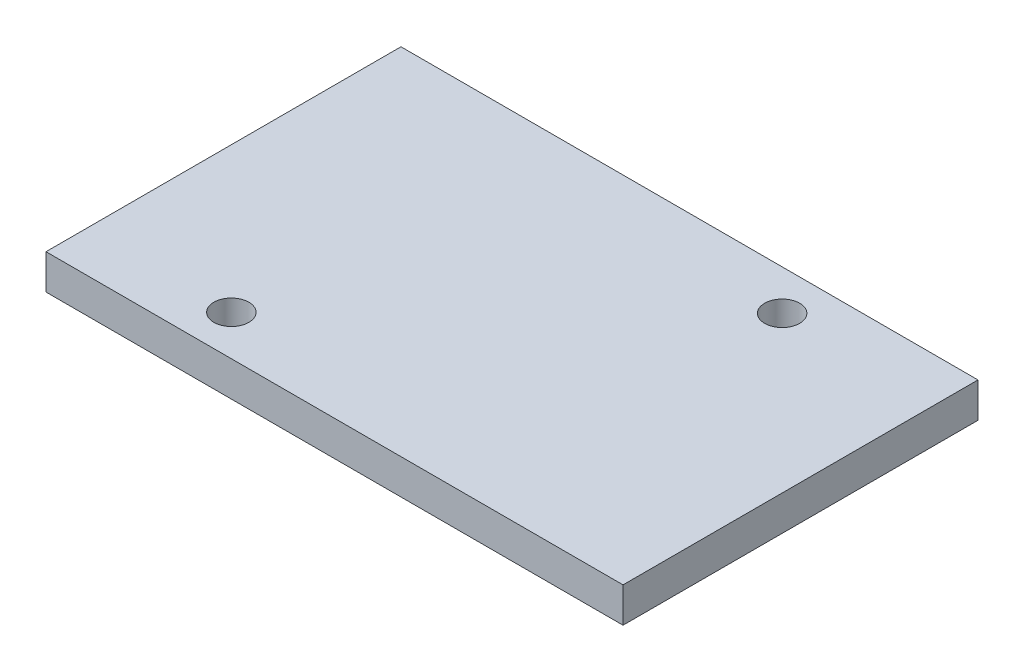
ISO-10303-21;
HEADER;
FILE_DESCRIPTION(('STEP AP214'),'2;1');
FILE_NAME('part.step','',(''),(''),'','','');
FILE_SCHEMA(('AUTOMOTIVE_DESIGN { 1 0 10303 214 1 1 1 1 }'));
ENDSEC;
DATA;
#1=APPLICATION_CONTEXT('core data for automotive mechanical design processes');
#2=APPLICATION_PROTOCOL_DEFINITION('international standard','automotive_design',2000,#1);
#3=PRODUCT_CONTEXT('',#1,'mechanical');
#4=PRODUCT('Part','Part','',(#3));
#5=PRODUCT_RELATED_PRODUCT_CATEGORY('part','',(#4));
#6=PRODUCT_DEFINITION_FORMATION('','',#4);
#7=PRODUCT_DEFINITION_CONTEXT('part definition',#1,'design');
#8=PRODUCT_DEFINITION('design','',#6,#7);
#9=PRODUCT_DEFINITION_SHAPE('','',#8);
#10=(LENGTH_UNIT() NAMED_UNIT(*) SI_UNIT(.MILLI.,.METRE.));
#11=(NAMED_UNIT(*) PLANE_ANGLE_UNIT() SI_UNIT($,.RADIAN.));
#12=(NAMED_UNIT(*) SI_UNIT($,.STERADIAN.) SOLID_ANGLE_UNIT());
#13=UNCERTAINTY_MEASURE_WITH_UNIT(LENGTH_MEASURE(1.E-05),#10,'distance_accuracy_value','');
#14=(GEOMETRIC_REPRESENTATION_CONTEXT(3) GLOBAL_UNCERTAINTY_ASSIGNED_CONTEXT((#13)) GLOBAL_UNIT_ASSIGNED_CONTEXT((#10,
#11,#12)) REPRESENTATION_CONTEXT('',''));
#15=CARTESIAN_POINT('',(0.,0.,0.));
#16=DIRECTION('',(0.,0.,1.));
#17=DIRECTION('',(1.,0.,0.));
#18=AXIS2_PLACEMENT_3D('',#15,#16,#17);
#19=CARTESIAN_POINT('',(0.,2.,0.));
#20=DIRECTION('',(0.,1.,0.));
#21=DIRECTION('',(0.,0.,1.));
#22=AXIS2_PLACEMENT_3D('',#19,#20,#21);
#23=PLANE('',#22);
#24=CARTESIAN_POINT('',(-109.969565217391,2.,-10.3538043478261));
#25=DIRECTION('',(0.,1.,0.));
#26=DIRECTION('',(0.,0.,1.));
#27=AXIS2_PLACEMENT_3D('',#24,#25,#26);
#28=CIRCLE('',#27,0.999999999999998);
#29=CARTESIAN_POINT('',(-109.969565217391,2.,-9.35380434782608));
#30=VERTEX_POINT('',#29);
#31=EDGE_CURVE('E112',#30,#30,#28,.T.);
#32=ORIENTED_EDGE('',*,*,#31,.F.);
#33=EDGE_LOOP('',(#32));
#34=FACE_BOUND('',#33,.T.);
#35=DIRECTION('',(0.,0.,1.));
#36=VECTOR('',#35,1.);
#37=CARTESIAN_POINT('',(-118.269565217391,2.,-28.3538043478261));
#38=LINE('',#37,#36);
#39=CARTESIAN_POINT('',(-118.269565217391,2.,-28.3538043478261));
#40=VERTEX_POINT('',#39);
#41=CARTESIAN_POINT('',(-118.269565217391,2.,-8.05380434782608));
#42=VERTEX_POINT('',#41);
#43=EDGE_CURVE('E92',#40,#42,#38,.T.);
#44=ORIENTED_EDGE('',*,*,#43,.T.);
#45=DIRECTION('',(1.,0.,0.));
#46=VECTOR('',#45,1.);
#47=CARTESIAN_POINT('',(-118.269565217391,2.,-8.05380434782608));
#48=LINE('',#47,#46);
#49=CARTESIAN_POINT('',(-85.2695652173913,2.,-8.05380434782608));
#50=VERTEX_POINT('',#49);
#51=EDGE_CURVE('E87',#42,#50,#48,.T.);
#52=ORIENTED_EDGE('',*,*,#51,.T.);
#53=DIRECTION('',(0.,0.,-1.));
#54=VECTOR('',#53,1.);
#55=CARTESIAN_POINT('',(-85.2695652173913,2.,-28.3538043478261));
#56=LINE('',#55,#54);
#57=CARTESIAN_POINT('',(-85.2695652173913,2.,-28.3538043478261));
#58=VERTEX_POINT('',#57);
#59=EDGE_CURVE('E90',#50,#58,#56,.T.);
#60=ORIENTED_EDGE('',*,*,#59,.T.);
#61=DIRECTION('',(-1.,0.,0.));
#62=VECTOR('',#61,1.);
#63=CARTESIAN_POINT('',(-118.269565217391,2.,-28.3538043478261));
#64=LINE('',#63,#62);
#65=EDGE_CURVE('E57',#58,#40,#64,.T.);
#66=ORIENTED_EDGE('',*,*,#65,.T.);
#67=EDGE_LOOP('',(#44,#52,#60,#66));
#68=FACE_BOUND('',#67,.T.);
#69=CARTESIAN_POINT('',(-94.1695652173913,2.,-26.0538043478261));
#70=DIRECTION('',(0.,1.,0.));
#71=DIRECTION('',(0.,0.,1.));
#72=AXIS2_PLACEMENT_3D('',#69,#70,#71);
#73=CIRCLE('',#72,0.999999999999998);
#74=CARTESIAN_POINT('',(-94.1695652173913,2.,-25.0538043478261));
#75=VERTEX_POINT('',#74);
#76=EDGE_CURVE('E134',#75,#75,#73,.T.);
#77=ORIENTED_EDGE('',*,*,#76,.F.);
#78=EDGE_LOOP('',(#77));
#79=FACE_BOUND('',#78,.T.);
#80=ADVANCED_FACE('F39',(#34,#68,#79),#23,.T.);
#81=CARTESIAN_POINT('',(0.,0.,0.));
#82=DIRECTION('',(0.,1.,0.));
#83=DIRECTION('',(0.,0.,1.));
#84=AXIS2_PLACEMENT_3D('',#81,#82,#83);
#85=PLANE('',#84);
#86=DIRECTION('',(0.,0.,1.));
#87=VECTOR('',#86,1.);
#88=CARTESIAN_POINT('',(-118.269565217391,0.,-28.3538043478261));
#89=LINE('',#88,#87);
#90=CARTESIAN_POINT('',(-118.269565217391,0.,-28.3538043478261));
#91=VERTEX_POINT('',#90);
#92=CARTESIAN_POINT('',(-118.269565217391,0.,-8.05380434782608));
#93=VERTEX_POINT('',#92);
#94=EDGE_CURVE('E108',#91,#93,#89,.T.);
#95=ORIENTED_EDGE('',*,*,#94,.F.);
#96=DIRECTION('',(-1.,0.,0.));
#97=VECTOR('',#96,1.);
#98=CARTESIAN_POINT('',(-118.269565217391,0.,-28.3538043478261));
#99=LINE('',#98,#97);
#100=CARTESIAN_POINT('',(-85.2695652173913,0.,-28.3538043478261));
#101=VERTEX_POINT('',#100);
#102=EDGE_CURVE('E80',#101,#91,#99,.T.);
#103=ORIENTED_EDGE('',*,*,#102,.F.);
#104=DIRECTION('',(0.,0.,-1.));
#105=VECTOR('',#104,1.);
#106=CARTESIAN_POINT('',(-85.2695652173913,0.,-28.3538043478261));
#107=LINE('',#106,#105);
#108=CARTESIAN_POINT('',(-85.2695652173913,0.,-8.05380434782608));
#109=VERTEX_POINT('',#108);
#110=EDGE_CURVE('E74',#109,#101,#107,.T.);
#111=ORIENTED_EDGE('',*,*,#110,.F.);
#112=DIRECTION('',(1.,0.,0.));
#113=VECTOR('',#112,1.);
#114=CARTESIAN_POINT('',(-118.269565217391,0.,-8.05380434782608));
#115=LINE('',#114,#113);
#116=EDGE_CURVE('E97',#93,#109,#115,.T.);
#117=ORIENTED_EDGE('',*,*,#116,.F.);
#118=EDGE_LOOP('',(#95,#103,#111,#117));
#119=FACE_BOUND('',#118,.T.);
#120=CARTESIAN_POINT('',(-109.969565217391,0.,-10.3538043478261));
#121=DIRECTION('',(0.,1.,0.));
#122=DIRECTION('',(0.,0.,1.));
#123=AXIS2_PLACEMENT_3D('',#120,#121,#122);
#124=CIRCLE('',#123,0.999999999999998);
#125=CARTESIAN_POINT('',(-109.969565217391,0.,-9.35380434782608));
#126=VERTEX_POINT('',#125);
#127=EDGE_CURVE('E130',#126,#126,#124,.T.);
#128=ORIENTED_EDGE('',*,*,#127,.T.);
#129=EDGE_LOOP('',(#128));
#130=FACE_BOUND('',#129,.T.);
#131=CARTESIAN_POINT('',(-94.1695652173913,0.,-26.0538043478261));
#132=DIRECTION('',(0.,1.,0.));
#133=DIRECTION('',(0.,0.,1.));
#134=AXIS2_PLACEMENT_3D('',#131,#132,#133);
#135=CIRCLE('',#134,0.999999999999998);
#136=CARTESIAN_POINT('',(-94.1695652173913,0.,-25.0538043478261));
#137=VERTEX_POINT('',#136);
#138=EDGE_CURVE('E138',#137,#137,#135,.T.);
#139=ORIENTED_EDGE('',*,*,#138,.T.);
#140=EDGE_LOOP('',(#139));
#141=FACE_BOUND('',#140,.T.);
#142=ADVANCED_FACE('F125',(#119,#130,#141),#85,.F.);
#143=CARTESIAN_POINT('',(-118.269565217391,2.,-28.3538043478261));
#144=DIRECTION('',(1.,0.,0.));
#145=DIRECTION('',(0.,0.,-1.));
#146=AXIS2_PLACEMENT_3D('',#143,#144,#145);
#147=PLANE('',#146);
#148=ORIENTED_EDGE('',*,*,#94,.T.);
#149=DIRECTION('',(0.,-1.,0.));
#150=VECTOR('',#149,1.);
#151=CARTESIAN_POINT('',(-118.269565217391,2.,-8.05380434782608));
#152=LINE('',#151,#150);
#153=EDGE_CURVE('E11',#42,#93,#152,.T.);
#154=ORIENTED_EDGE('',*,*,#153,.F.);
#155=ORIENTED_EDGE('',*,*,#43,.F.);
#156=DIRECTION('',(0.,-1.,0.));
#157=VECTOR('',#156,1.);
#158=CARTESIAN_POINT('',(-118.269565217391,2.,-28.3538043478261));
#159=LINE('',#158,#157);
#160=EDGE_CURVE('E104',#40,#91,#159,.T.);
#161=ORIENTED_EDGE('',*,*,#160,.T.);
#162=EDGE_LOOP('',(#148,#154,#155,#161));
#163=FACE_BOUND('',#162,.T.);
#164=ADVANCED_FACE('F41',(#163),#147,.F.);
#165=CARTESIAN_POINT('',(-118.269565217391,2.,-8.05380434782608));
#166=DIRECTION('',(0.,0.,-1.));
#167=DIRECTION('',(-1.,0.,0.));
#168=AXIS2_PLACEMENT_3D('',#165,#166,#167);
#169=PLANE('',#168);
#170=ORIENTED_EDGE('',*,*,#116,.T.);
#171=DIRECTION('',(0.,-1.,0.));
#172=VECTOR('',#171,1.);
#173=CARTESIAN_POINT('',(-85.2695652173913,2.,-8.05380434782608));
#174=LINE('',#173,#172);
#175=EDGE_CURVE('E49',#50,#109,#174,.T.);
#176=ORIENTED_EDGE('',*,*,#175,.F.);
#177=ORIENTED_EDGE('',*,*,#51,.F.);
#178=ORIENTED_EDGE('',*,*,#153,.T.);
#179=EDGE_LOOP('',(#170,#176,#177,#178));
#180=FACE_BOUND('',#179,.T.);
#181=ADVANCED_FACE('F96',(#180),#169,.F.);
#182=CARTESIAN_POINT('',(-85.2695652173913,2.,-28.3538043478261));
#183=DIRECTION('',(-1.,0.,0.));
#184=DIRECTION('',(0.,0.,1.));
#185=AXIS2_PLACEMENT_3D('',#182,#183,#184);
#186=PLANE('',#185);
#187=ORIENTED_EDGE('',*,*,#110,.T.);
#188=DIRECTION('',(0.,-1.,0.));
#189=VECTOR('',#188,1.);
#190=CARTESIAN_POINT('',(-85.2695652173913,2.,-28.3538043478261));
#191=LINE('',#190,#189);
#192=EDGE_CURVE('E99',#58,#101,#191,.T.);
#193=ORIENTED_EDGE('',*,*,#192,.F.);
#194=ORIENTED_EDGE('',*,*,#59,.F.);
#195=ORIENTED_EDGE('',*,*,#175,.T.);
#196=EDGE_LOOP('',(#187,#193,#194,#195));
#197=FACE_BOUND('',#196,.T.);
#198=ADVANCED_FACE('F100',(#197),#186,.F.);
#199=CARTESIAN_POINT('',(-118.269565217391,2.,-28.3538043478261));
#200=DIRECTION('',(0.,0.,1.));
#201=DIRECTION('',(1.,0.,0.));
#202=AXIS2_PLACEMENT_3D('',#199,#200,#201);
#203=PLANE('',#202);
#204=ORIENTED_EDGE('',*,*,#102,.T.);
#205=ORIENTED_EDGE('',*,*,#160,.F.);
#206=ORIENTED_EDGE('',*,*,#65,.F.);
#207=ORIENTED_EDGE('',*,*,#192,.T.);
#208=EDGE_LOOP('',(#204,#205,#206,#207));
#209=FACE_BOUND('',#208,.T.);
#210=ADVANCED_FACE('F122',(#209),#203,.F.);
#211=CARTESIAN_POINT('',(-109.969565217391,2.,-10.3538043478261));
#212=DIRECTION('',(0.,-1.,0.));
#213=DIRECTION('',(0.,0.,-1.));
#214=AXIS2_PLACEMENT_3D('',#211,#212,#213);
#215=CYLINDRICAL_SURFACE('',#214,0.999999999999998);
#216=ORIENTED_EDGE('',*,*,#31,.T.);
#217=EDGE_LOOP('',(#216));
#218=FACE_BOUND('',#217,.T.);
#219=ORIENTED_EDGE('',*,*,#127,.F.);
#220=EDGE_LOOP('',(#219));
#221=FACE_BOUND('',#220,.T.);
#222=ADVANCED_FACE('F157',(#218,#221),#215,.F.);
#223=CARTESIAN_POINT('',(-94.1695652173913,2.,-26.0538043478261));
#224=DIRECTION('',(0.,-1.,0.));
#225=DIRECTION('',(0.,0.,-1.));
#226=AXIS2_PLACEMENT_3D('',#223,#224,#225);
#227=CYLINDRICAL_SURFACE('',#226,0.999999999999998);
#228=ORIENTED_EDGE('',*,*,#76,.T.);
#229=EDGE_LOOP('',(#228));
#230=FACE_BOUND('',#229,.T.);
#231=ORIENTED_EDGE('',*,*,#138,.F.);
#232=EDGE_LOOP('',(#231));
#233=FACE_BOUND('',#232,.T.);
#234=ADVANCED_FACE('F146',(#230,#233),#227,.F.);
#235=CLOSED_SHELL('',(#80,#142,#164,#181,#198,#210,#222,#234));
#236=MANIFOLD_SOLID_BREP('B2',#235);
#237=ADVANCED_BREP_SHAPE_REPRESENTATION('',(#18,#236),#14);
#238=SHAPE_DEFINITION_REPRESENTATION(#9,#237);
ENDSEC;
END-ISO-10303-21;
